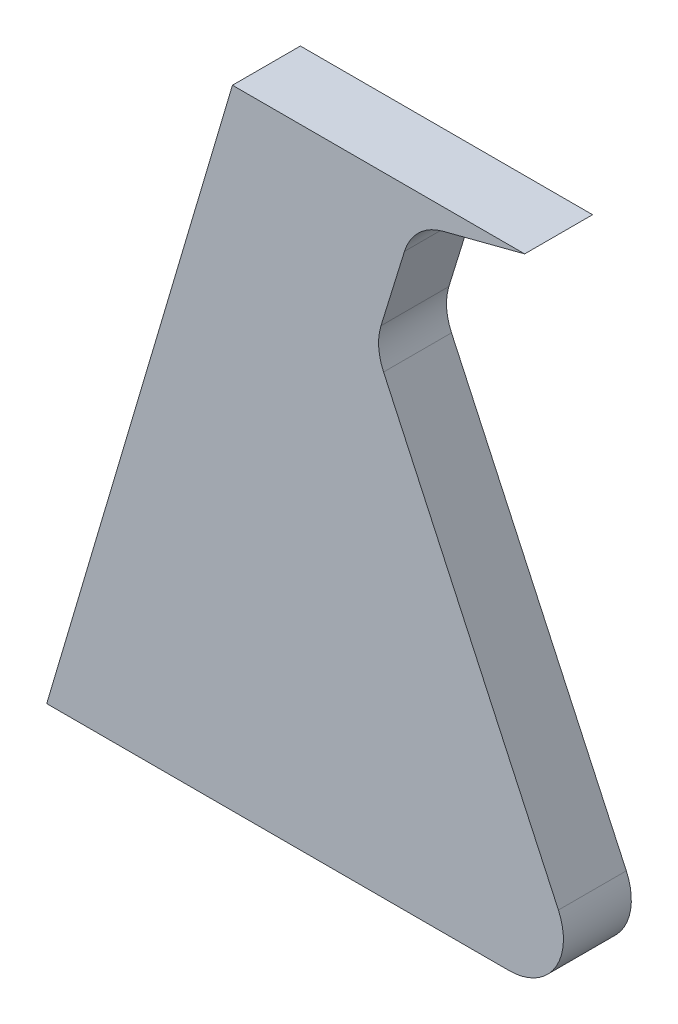
ISO-10303-21;
HEADER;
FILE_DESCRIPTION(('STEP AP214'),'2;1');
FILE_NAME('part.step','',(''),(''),'','','');
FILE_SCHEMA(('AUTOMOTIVE_DESIGN { 1 0 10303 214 1 1 1 1 }'));
ENDSEC;
DATA;
#1=APPLICATION_CONTEXT('core data for automotive mechanical design processes');
#2=APPLICATION_PROTOCOL_DEFINITION('international standard','automotive_design',2000,#1);
#3=PRODUCT_CONTEXT('',#1,'mechanical');
#4=PRODUCT('Part','Part','',(#3));
#5=PRODUCT_RELATED_PRODUCT_CATEGORY('part','',(#4));
#6=PRODUCT_DEFINITION_FORMATION('','',#4);
#7=PRODUCT_DEFINITION_CONTEXT('part definition',#1,'design');
#8=PRODUCT_DEFINITION('design','',#6,#7);
#9=PRODUCT_DEFINITION_SHAPE('','',#8);
#10=(LENGTH_UNIT() NAMED_UNIT(*) SI_UNIT(.MILLI.,.METRE.));
#11=(NAMED_UNIT(*) PLANE_ANGLE_UNIT() SI_UNIT($,.RADIAN.));
#12=(NAMED_UNIT(*) SI_UNIT($,.STERADIAN.) SOLID_ANGLE_UNIT());
#13=UNCERTAINTY_MEASURE_WITH_UNIT(LENGTH_MEASURE(1.E-05),#10,'distance_accuracy_value','');
#14=(GEOMETRIC_REPRESENTATION_CONTEXT(3) GLOBAL_UNCERTAINTY_ASSIGNED_CONTEXT((#13)) GLOBAL_UNIT_ASSIGNED_CONTEXT((#10,
#11,#12)) REPRESENTATION_CONTEXT('',''));
#15=CARTESIAN_POINT('',(0.,0.,0.));
#16=DIRECTION('',(0.,0.,1.));
#17=DIRECTION('',(1.,0.,0.));
#18=AXIS2_PLACEMENT_3D('',#15,#16,#17);
#19=CARTESIAN_POINT('',(-3.788878805006,-7.668347946319,0.));
#20=DIRECTION('',(0.,0.,1.));
#21=DIRECTION('',(-0.690993368401881,0.722861096494079,0.));
#22=AXIS2_PLACEMENT_3D('',#19,#20,#21);
#23=CYLINDRICAL_SURFACE('',#22,0.08);
#24=CARTESIAN_POINT('',(-3.788878805006,-7.668347946319,0.));
#25=DIRECTION('',(0.,0.,-1.));
#26=DIRECTION('',(-0.690993368401881,0.722861096494079,0.));
#27=AXIS2_PLACEMENT_3D('',#24,#25,#26);
#28=CIRCLE('',#27,0.08);
#29=CARTESIAN_POINT('',(-3.865324099159,-7.644765813214,0.));
#30=VERTEX_POINT('',#29);
#31=CARTESIAN_POINT('',(-3.808992644853,-7.590917761982,0.));
#32=VERTEX_POINT('',#31);
#33=EDGE_CURVE('E11',#30,#32,#28,.T.);
#34=ORIENTED_EDGE('',*,*,#33,.T.);
#35=DIRECTION('',(0.,0.,1.));
#36=VECTOR('',#35,1.);
#37=CARTESIAN_POINT('',(-3.808992644853,-7.590917761982,0.));
#38=LINE('',#37,#36);
#39=CARTESIAN_POINT('',(-3.808992644853,-7.590917761982,0.1));
#40=VERTEX_POINT('',#39);
#41=EDGE_CURVE('E24',#32,#40,#38,.T.);
#42=ORIENTED_EDGE('',*,*,#41,.T.);
#43=CARTESIAN_POINT('',(-3.788878805006,-7.668347946319,0.1));
#44=DIRECTION('',(0.,0.,1.));
#45=DIRECTION('',(-0.690993368401881,0.722861096494079,0.));
#46=AXIS2_PLACEMENT_3D('',#43,#44,#45);
#47=CIRCLE('',#46,0.08);
#48=CARTESIAN_POINT('',(-3.865324099159,-7.644765813214,0.1));
#49=VERTEX_POINT('',#48);
#50=EDGE_CURVE('E160',#40,#49,#47,.T.);
#51=ORIENTED_EDGE('',*,*,#50,.T.);
#52=DIRECTION('',(0.,0.,-1.));
#53=VECTOR('',#52,1.);
#54=CARTESIAN_POINT('',(-3.865324099159,-7.644765813214,0.));
#55=LINE('',#54,#53);
#56=EDGE_CURVE('E36',#49,#30,#55,.T.);
#57=ORIENTED_EDGE('',*,*,#56,.T.);
#58=EDGE_LOOP('',(#34,#42,#51,#57));
#59=FACE_BOUND('',#58,.T.);
#60=ADVANCED_FACE('F17',(#59),#23,.F.);
#61=CARTESIAN_POINT('',(-3.852173070779,-7.602134630171,0.));
#62=DIRECTION('',(0.251422998089588,-0.967877304223858,0.));
#63=DIRECTION('',(0.967877304223858,0.251422998089588,0.));
#64=AXIS2_PLACEMENT_3D('',#61,#62,#63);
#65=PLANE('',#64);
#66=ORIENTED_EDGE('',*,*,#41,.F.);
#67=DIRECTION('',(0.967877304223858,0.251422998089588,0.));
#68=VECTOR('',#67,1.);
#69=CARTESIAN_POINT('',(-3.852173070779,-7.602134630171,0.));
#70=LINE('',#69,#68);
#71=CARTESIAN_POINT('',(-3.688364469457,-7.559582491096,0.));
#72=VERTEX_POINT('',#71);
#73=EDGE_CURVE('E157',#32,#72,#70,.T.);
#74=ORIENTED_EDGE('',*,*,#73,.T.);
#75=DIRECTION('',(0.,0.,1.));
#76=VECTOR('',#75,1.);
#77=CARTESIAN_POINT('',(-3.688364469457,-7.559582491096,0.));
#78=LINE('',#77,#76);
#79=CARTESIAN_POINT('',(-3.688364469457,-7.559582491096,0.1));
#80=VERTEX_POINT('',#79);
#81=EDGE_CURVE('E109',#72,#80,#78,.T.);
#82=ORIENTED_EDGE('',*,*,#81,.T.);
#83=DIRECTION('',(0.967877304223858,0.251422998089588,0.));
#84=VECTOR('',#83,1.);
#85=CARTESIAN_POINT('',(-3.852173070779,-7.602134630171,0.1));
#86=LINE('',#85,#84);
#87=EDGE_CURVE('E153',#40,#80,#86,.T.);
#88=ORIENTED_EDGE('',*,*,#87,.F.);
#89=EDGE_LOOP('',(#66,#74,#82,#88));
#90=FACE_BOUND('',#89,.T.);
#91=ADVANCED_FACE('F161',(#90),#65,.T.);
#92=CARTESIAN_POINT('',(-3.823486046405,-7.780532910114,0.));
#93=DIRECTION('',(0.,0.,1.));
#94=DIRECTION('',(-0.997774022680354,-0.066685828061622,0.));
#95=AXIS2_PLACEMENT_3D('',#92,#93,#94);
#96=CYLINDRICAL_SURFACE('',#95,0.08);
#97=CARTESIAN_POINT('',(-3.823486046405,-7.780532910114,0.));
#98=DIRECTION('',(0.,0.,-1.));
#99=DIRECTION('',(-0.997774022680354,-0.066685828061622,0.));
#100=AXIS2_PLACEMENT_3D('',#97,#98,#99);
#101=CIRCLE('',#100,0.08);
#102=CARTESIAN_POINT('',(-3.896113249134,-7.814078243975,0.));
#103=VERTEX_POINT('',#102);
#104=CARTESIAN_POINT('',(-3.899931340559,-7.756950777009,0.));
#105=VERTEX_POINT('',#104);
#106=EDGE_CURVE('E150',#103,#105,#101,.T.);
#107=ORIENTED_EDGE('',*,*,#106,.T.);
#108=DIRECTION('',(0.,0.,1.));
#109=VECTOR('',#108,1.);
#110=CARTESIAN_POINT('',(-3.899931340559,-7.756950777009,0.));
#111=LINE('',#110,#109);
#112=CARTESIAN_POINT('',(-3.899931340559,-7.756950777009,0.1));
#113=VERTEX_POINT('',#112);
#114=EDGE_CURVE('E147',#105,#113,#111,.T.);
#115=ORIENTED_EDGE('',*,*,#114,.T.);
#116=CARTESIAN_POINT('',(-3.823486046405,-7.780532910114,0.1));
#117=DIRECTION('',(0.,0.,1.));
#118=DIRECTION('',(-0.997774022680354,-0.066685828061622,0.));
#119=AXIS2_PLACEMENT_3D('',#116,#117,#118);
#120=CIRCLE('',#119,0.08);
#121=CARTESIAN_POINT('',(-3.896113249134,-7.814078243975,0.1));
#122=VERTEX_POINT('',#121);
#123=EDGE_CURVE('E144',#113,#122,#120,.T.);
#124=ORIENTED_EDGE('',*,*,#123,.T.);
#125=DIRECTION('',(0.,0.,-1.));
#126=VECTOR('',#125,1.);
#127=CARTESIAN_POINT('',(-3.896113249134,-7.814078243975,0.));
#128=LINE('',#127,#126);
#129=EDGE_CURVE('E142',#122,#103,#128,.T.);
#130=ORIENTED_EDGE('',*,*,#129,.T.);
#131=EDGE_LOOP('',(#107,#115,#124,#130));
#132=FACE_BOUND('',#131,.T.);
#133=ADVANCED_FACE('F194',(#132),#96,.F.);
#134=CARTESIAN_POINT('',(-3.908968470533,-7.786246093769,0.));
#135=DIRECTION('',(0.955566176917727,-0.294776663816592,0.));
#136=DIRECTION('',(0.294776663816592,0.955566176917727,0.));
#137=AXIS2_PLACEMENT_3D('',#134,#135,#136);
#138=PLANE('',#137);
#139=ORIENTED_EDGE('',*,*,#56,.F.);
#140=DIRECTION('',(0.294776663816592,0.955566176917727,0.));
#141=VECTOR('',#140,1.);
#142=CARTESIAN_POINT('',(-3.908968470533,-7.786246093769,0.1));
#143=LINE('',#142,#141);
#144=EDGE_CURVE('E139',#113,#49,#143,.T.);
#145=ORIENTED_EDGE('',*,*,#144,.F.);
#146=ORIENTED_EDGE('',*,*,#114,.F.);
#147=DIRECTION('',(0.294776663816592,0.955566176917727,0.));
#148=VECTOR('',#147,1.);
#149=CARTESIAN_POINT('',(-3.908968470533,-7.786246093769,0.));
#150=LINE('',#149,#148);
#151=EDGE_CURVE('E136',#105,#30,#150,.T.);
#152=ORIENTED_EDGE('',*,*,#151,.T.);
#153=EDGE_LOOP('',(#139,#145,#146,#152));
#154=FACE_BOUND('',#153,.T.);
#155=ADVANCED_FACE('F166',(#154),#138,.T.);
#156=CARTESIAN_POINT('',(-3.711302924095,-8.404987758415,0.));
#157=DIRECTION('',(0.,0.,1.));
#158=DIRECTION('',(0.842412213008156,-0.53883361381293,0.));
#159=AXIS2_PLACEMENT_3D('',#156,#157,#158);
#160=CYLINDRICAL_SURFACE('',#159,0.08);
#161=CARTESIAN_POINT('',(-3.711302924095,-8.404987758415,0.1));
#162=DIRECTION('',(0.,0.,-1.));
#163=DIRECTION('',(0.842412213008156,-0.53883361381293,0.));
#164=AXIS2_PLACEMENT_3D('',#161,#162,#163);
#165=CIRCLE('',#164,0.08);
#166=CARTESIAN_POINT('',(-3.638675721366,-8.371442424555,0.1));
#167=VERTEX_POINT('',#166);
#168=CARTESIAN_POINT('',(-3.711302924095,-8.484987758415,0.1));
#169=VERTEX_POINT('',#168);
#170=EDGE_CURVE('E134',#167,#169,#165,.T.);
#171=ORIENTED_EDGE('',*,*,#170,.T.);
#172=DIRECTION('',(0.,0.,-1.));
#173=VECTOR('',#172,1.);
#174=CARTESIAN_POINT('',(-3.711302924095,-8.484987758415,0.));
#175=LINE('',#174,#173);
#176=CARTESIAN_POINT('',(-3.711302924095,-8.484987758415,0.));
#177=VERTEX_POINT('',#176);
#178=EDGE_CURVE('E132',#169,#177,#175,.T.);
#179=ORIENTED_EDGE('',*,*,#178,.T.);
#180=CARTESIAN_POINT('',(-3.711302924095,-8.404987758415,0.));
#181=DIRECTION('',(0.,0.,1.));
#182=DIRECTION('',(0.842412213008156,-0.53883361381293,0.));
#183=AXIS2_PLACEMENT_3D('',#180,#181,#182);
#184=CIRCLE('',#183,0.08);
#185=CARTESIAN_POINT('',(-3.638675721366,-8.371442424555,0.));
#186=VERTEX_POINT('',#185);
#187=EDGE_CURVE('E130',#177,#186,#184,.T.);
#188=ORIENTED_EDGE('',*,*,#187,.T.);
#189=DIRECTION('',(0.,0.,1.));
#190=VECTOR('',#189,1.);
#191=CARTESIAN_POINT('',(-3.638675721366,-8.371442424555,0.));
#192=LINE('',#191,#190);
#193=EDGE_CURVE('E127',#186,#167,#192,.T.);
#194=ORIENTED_EDGE('',*,*,#193,.T.);
#195=EDGE_LOOP('',(#171,#179,#188,#194));
#196=FACE_BOUND('',#195,.T.);
#197=ADVANCED_FACE('F176',(#196),#160,.T.);
#198=CARTESIAN_POINT('',(-3.982016879554,-8.0592246869,0.1));
#199=DIRECTION('',(0.,0.,1.));
#200=DIRECTION('',(1.,0.,0.));
#201=AXIS2_PLACEMENT_3D('',#198,#199,#200);
#202=PLANE('',#201);
#203=ORIENTED_EDGE('',*,*,#170,.F.);
#204=DIRECTION('',(-0.419316673250581,0.907840034110672,0.));
#205=VECTOR('',#204,1.);
#206=CARTESIAN_POINT('',(-3.586230962523,-8.484987758415,0.1));
#207=LINE('',#206,#205);
#208=EDGE_CURVE('E124',#167,#122,#207,.T.);
#209=ORIENTED_EDGE('',*,*,#208,.T.);
#210=ORIENTED_EDGE('',*,*,#123,.F.);
#211=ORIENTED_EDGE('',*,*,#144,.T.);
#212=ORIENTED_EDGE('',*,*,#50,.F.);
#213=ORIENTED_EDGE('',*,*,#87,.T.);
#214=DIRECTION('',(-1.,0.,0.));
#215=VECTOR('',#214,1.);
#216=CARTESIAN_POINT('',(-3.688364469457,-7.559582491096,0.1));
#217=LINE('',#216,#215);
#218=CARTESIAN_POINT('',(-4.118650144526,-7.559582491096,0.1));
#219=VERTEX_POINT('',#218);
#220=EDGE_CURVE('E122',#80,#219,#217,.T.);
#221=ORIENTED_EDGE('',*,*,#220,.T.);
#222=DIRECTION('',(-0.283427278082514,-0.958993732012226,0.));
#223=VECTOR('',#222,1.);
#224=CARTESIAN_POINT('',(-4.118650144526,-7.559582491096,0.1));
#225=LINE('',#224,#223);
#226=CARTESIAN_POINT('',(-4.39215046813,-8.484987758415,0.1));
#227=VERTEX_POINT('',#226);
#228=EDGE_CURVE('E103',#219,#227,#225,.T.);
#229=ORIENTED_EDGE('',*,*,#228,.T.);
#230=DIRECTION('',(1.,0.,0.));
#231=VECTOR('',#230,1.);
#232=CARTESIAN_POINT('',(-4.39215046813,-8.484987758415,0.1));
#233=LINE('',#232,#231);
#234=EDGE_CURVE('E118',#227,#169,#233,.T.);
#235=ORIENTED_EDGE('',*,*,#234,.T.);
#236=EDGE_LOOP('',(#203,#209,#210,#211,#212,#213,#221,#229,#235));
#237=FACE_BOUND('',#236,.T.);
#238=ADVANCED_FACE('F163',(#237),#202,.T.);
#239=CARTESIAN_POINT('',(-3.586230962523,-8.484987758415,0.));
#240=DIRECTION('',(0.907840034110672,0.419316673250581,0.));
#241=DIRECTION('',(-0.419316673250581,0.907840034110672,0.));
#242=AXIS2_PLACEMENT_3D('',#239,#240,#241);
#243=PLANE('',#242);
#244=ORIENTED_EDGE('',*,*,#129,.F.);
#245=ORIENTED_EDGE('',*,*,#208,.F.);
#246=ORIENTED_EDGE('',*,*,#193,.F.);
#247=DIRECTION('',(-0.419316673250581,0.907840034110672,0.));
#248=VECTOR('',#247,1.);
#249=CARTESIAN_POINT('',(-3.586230962523,-8.484987758415,0.));
#250=LINE('',#249,#248);
#251=EDGE_CURVE('E115',#186,#103,#250,.T.);
#252=ORIENTED_EDGE('',*,*,#251,.T.);
#253=EDGE_LOOP('',(#244,#245,#246,#252));
#254=FACE_BOUND('',#253,.T.);
#255=ADVANCED_FACE('F173',(#254),#243,.T.);
#256=CARTESIAN_POINT('',(-4.39215046813,-8.484987758415,0.));
#257=DIRECTION('',(0.,-1.,0.));
#258=DIRECTION('',(1.,0.,0.));
#259=AXIS2_PLACEMENT_3D('',#256,#257,#258);
#260=PLANE('',#259);
#261=ORIENTED_EDGE('',*,*,#178,.F.);
#262=ORIENTED_EDGE('',*,*,#234,.F.);
#263=DIRECTION('',(0.,0.,1.));
#264=VECTOR('',#263,1.);
#265=CARTESIAN_POINT('',(-4.39215046813,-8.484987758415,0.));
#266=LINE('',#265,#264);
#267=CARTESIAN_POINT('',(-4.39215046813,-8.484987758415,0.));
#268=VERTEX_POINT('',#267);
#269=EDGE_CURVE('E113',#268,#227,#266,.T.);
#270=ORIENTED_EDGE('',*,*,#269,.F.);
#271=DIRECTION('',(1.,0.,0.));
#272=VECTOR('',#271,1.);
#273=CARTESIAN_POINT('',(-4.39215046813,-8.484987758415,0.));
#274=LINE('',#273,#272);
#275=EDGE_CURVE('E95',#268,#177,#274,.T.);
#276=ORIENTED_EDGE('',*,*,#275,.T.);
#277=EDGE_LOOP('',(#261,#262,#270,#276));
#278=FACE_BOUND('',#277,.T.);
#279=ADVANCED_FACE('F179',(#278),#260,.T.);
#280=CARTESIAN_POINT('',(-4.118650144526,-7.559582491096,0.));
#281=DIRECTION('',(-0.958993732012226,0.283427278082514,0.));
#282=DIRECTION('',(-0.283427278082514,-0.958993732012226,0.));
#283=AXIS2_PLACEMENT_3D('',#280,#281,#282);
#284=PLANE('',#283);
#285=DIRECTION('',(-0.283427278082514,-0.958993732012226,0.));
#286=VECTOR('',#285,1.);
#287=CARTESIAN_POINT('',(-4.118650144526,-7.559582491096,0.));
#288=LINE('',#287,#286);
#289=CARTESIAN_POINT('',(-4.118650144526,-7.559582491096,0.));
#290=VERTEX_POINT('',#289);
#291=EDGE_CURVE('E87',#290,#268,#288,.T.);
#292=ORIENTED_EDGE('',*,*,#291,.T.);
#293=ORIENTED_EDGE('',*,*,#269,.T.);
#294=ORIENTED_EDGE('',*,*,#228,.F.);
#295=DIRECTION('',(0.,0.,1.));
#296=VECTOR('',#295,1.);
#297=CARTESIAN_POINT('',(-4.118650144526,-7.559582491096,0.));
#298=LINE('',#297,#296);
#299=EDGE_CURVE('E98',#290,#219,#298,.T.);
#300=ORIENTED_EDGE('',*,*,#299,.F.);
#301=EDGE_LOOP('',(#292,#293,#294,#300));
#302=FACE_BOUND('',#301,.T.);
#303=ADVANCED_FACE('F102',(#302),#284,.T.);
#304=CARTESIAN_POINT('',(-3.688364469457,-7.559582491096,0.));
#305=DIRECTION('',(0.,1.,0.));
#306=DIRECTION('',(-1.,0.,0.));
#307=AXIS2_PLACEMENT_3D('',#304,#305,#306);
#308=PLANE('',#307);
#309=DIRECTION('',(-1.,0.,0.));
#310=VECTOR('',#309,1.);
#311=CARTESIAN_POINT('',(-3.688364469457,-7.559582491096,0.));
#312=LINE('',#311,#310);
#313=EDGE_CURVE('E93',#72,#290,#312,.T.);
#314=ORIENTED_EDGE('',*,*,#313,.T.);
#315=ORIENTED_EDGE('',*,*,#299,.T.);
#316=ORIENTED_EDGE('',*,*,#220,.F.);
#317=ORIENTED_EDGE('',*,*,#81,.F.);
#318=EDGE_LOOP('',(#314,#315,#316,#317));
#319=FACE_BOUND('',#318,.T.);
#320=ADVANCED_FACE('F108',(#319),#308,.T.);
#321=CARTESIAN_POINT('',(-3.982016879554,-8.0592246869,0.));
#322=DIRECTION('',(0.,0.,1.));
#323=DIRECTION('',(1.,0.,0.));
#324=AXIS2_PLACEMENT_3D('',#321,#322,#323);
#325=PLANE('',#324);
#326=ORIENTED_EDGE('',*,*,#187,.F.);
#327=ORIENTED_EDGE('',*,*,#275,.F.);
#328=ORIENTED_EDGE('',*,*,#291,.F.);
#329=ORIENTED_EDGE('',*,*,#313,.F.);
#330=ORIENTED_EDGE('',*,*,#73,.F.);
#331=ORIENTED_EDGE('',*,*,#33,.F.);
#332=ORIENTED_EDGE('',*,*,#151,.F.);
#333=ORIENTED_EDGE('',*,*,#106,.F.);
#334=ORIENTED_EDGE('',*,*,#251,.F.);
#335=EDGE_LOOP('',(#326,#327,#328,#329,#330,#331,#332,#333,#334));
#336=FACE_BOUND('',#335,.T.);
#337=ADVANCED_FACE('F90',(#336),#325,.F.);
#338=CLOSED_SHELL('',(#60,#91,#133,#155,#197,#238,#255,#279,#303,#320,#337));
#339=MANIFOLD_SOLID_BREP('B1',#338);
#340=ADVANCED_BREP_SHAPE_REPRESENTATION('',(#18,#339),#14);
#341=SHAPE_DEFINITION_REPRESENTATION(#9,#340);
ENDSEC;
END-ISO-10303-21;
